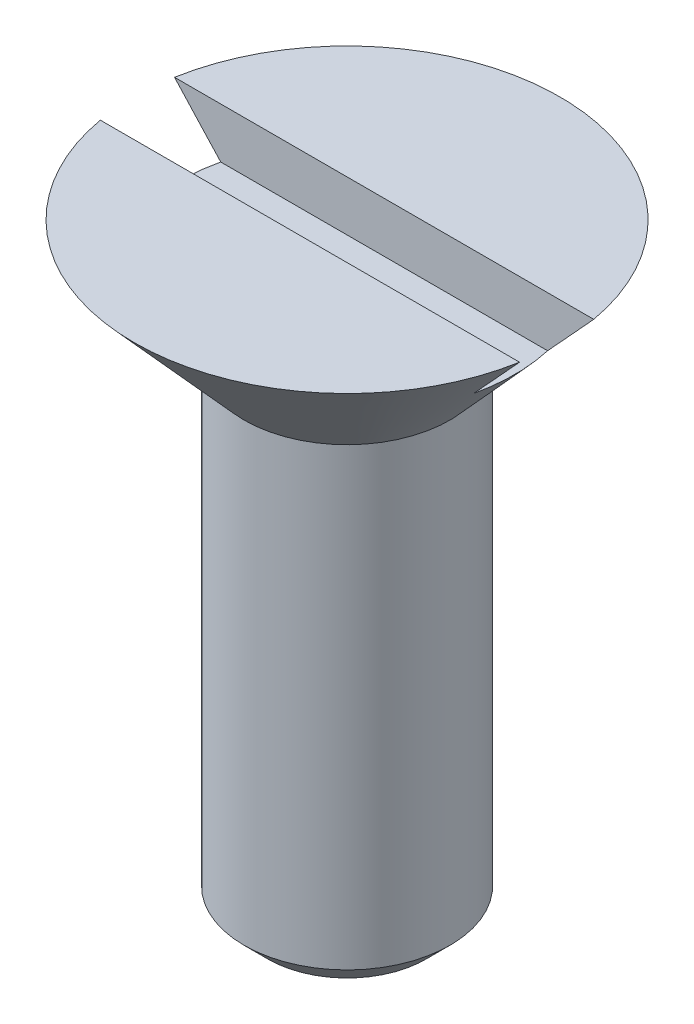
ISO-10303-21;
HEADER;
FILE_DESCRIPTION(('STEP AP214'),'2;1');
FILE_NAME('part.step','',(''),(''),'','','');
FILE_SCHEMA(('AUTOMOTIVE_DESIGN { 1 0 10303 214 1 1 1 1 }'));
ENDSEC;
DATA;
#1=APPLICATION_CONTEXT('core data for automotive mechanical design processes');
#2=APPLICATION_PROTOCOL_DEFINITION('international standard','automotive_design',2000,#1);
#3=PRODUCT_CONTEXT('',#1,'mechanical');
#4=PRODUCT('Part','Part','',(#3));
#5=PRODUCT_RELATED_PRODUCT_CATEGORY('part','',(#4));
#6=PRODUCT_DEFINITION_FORMATION('','',#4);
#7=PRODUCT_DEFINITION_CONTEXT('part definition',#1,'design');
#8=PRODUCT_DEFINITION('design','',#6,#7);
#9=PRODUCT_DEFINITION_SHAPE('','',#8);
#10=(LENGTH_UNIT() NAMED_UNIT(*) SI_UNIT(.MILLI.,.METRE.));
#11=(NAMED_UNIT(*) PLANE_ANGLE_UNIT() SI_UNIT($,.RADIAN.));
#12=(NAMED_UNIT(*) SI_UNIT($,.STERADIAN.) SOLID_ANGLE_UNIT());
#13=UNCERTAINTY_MEASURE_WITH_UNIT(LENGTH_MEASURE(1.E-05),#10,'distance_accuracy_value','');
#14=(GEOMETRIC_REPRESENTATION_CONTEXT(3) GLOBAL_UNCERTAINTY_ASSIGNED_CONTEXT((#13)) GLOBAL_UNIT_ASSIGNED_CONTEXT((#10,
#11,#12)) REPRESENTATION_CONTEXT('',''));
#15=CARTESIAN_POINT('',(0.,0.,0.));
#16=DIRECTION('',(0.,0.,1.));
#17=DIRECTION('',(1.,0.,0.));
#18=AXIS2_PLACEMENT_3D('',#15,#16,#17);
#19=CARTESIAN_POINT('',(0.,1.2954,0.));
#20=DIRECTION('',(0.,1.,0.));
#21=DIRECTION('',(0.,0.,1.));
#22=AXIS2_PLACEMENT_3D('',#19,#20,#21);
#23=PLANE('',#22);
#24=DIRECTION('',(1.,0.,0.));
#25=VECTOR('',#24,1.);
#26=CARTESIAN_POINT('',(0.,1.2954,0.3937));
#27=LINE('',#26,#25);
#28=CARTESIAN_POINT('',(-2.22400523384355,1.2954,0.3937));
#29=VERTEX_POINT('',#28);
#30=CARTESIAN_POINT('',(2.22400523384355,1.2954,0.3937));
#31=VERTEX_POINT('',#30);
#32=EDGE_CURVE('E81',#29,#31,#27,.T.);
#33=ORIENTED_EDGE('',*,*,#32,.F.);
#34=CARTESIAN_POINT('',(0.,1.2954,0.));
#35=DIRECTION('',(0.,-1.,0.));
#36=DIRECTION('',(0.,0.,-1.));
#37=AXIS2_PLACEMENT_3D('',#34,#35,#36);
#38=CIRCLE('',#37,2.25858339898343);
#39=EDGE_CURVE('E94',#31,#29,#38,.T.);
#40=ORIENTED_EDGE('',*,*,#39,.F.);
#41=EDGE_LOOP('',(#33,#40));
#42=FACE_BOUND('',#41,.T.);
#43=ADVANCED_FACE('F33',(#42),#23,.T.);
#44=CARTESIAN_POINT('',(0.,-5.08,0.));
#45=DIRECTION('',(0.,1.,0.));
#46=DIRECTION('',(0.,0.,1.));
#47=AXIS2_PLACEMENT_3D('',#44,#45,#46);
#48=CYLINDRICAL_SURFACE('',#47,1.0922);
#49=CARTESIAN_POINT('',(0.,-4.826,0.));
#50=DIRECTION('',(0.,1.,0.));
#51=DIRECTION('',(0.,0.,1.));
#52=AXIS2_PLACEMENT_3D('',#49,#50,#51);
#53=CIRCLE('',#52,1.0922);
#54=CARTESIAN_POINT('',(0.,-4.826,1.0922));
#55=VERTEX_POINT('',#54);
#56=EDGE_CURVE('E41',#55,#55,#53,.T.);
#57=ORIENTED_EDGE('',*,*,#56,.T.);
#58=EDGE_LOOP('',(#57));
#59=FACE_BOUND('',#58,.T.);
#60=CARTESIAN_POINT('',(0.,0.,0.));
#61=DIRECTION('',(0.,1.,0.));
#62=DIRECTION('',(0.,0.,1.));
#63=AXIS2_PLACEMENT_3D('',#60,#61,#62);
#64=CIRCLE('',#63,1.0922);
#65=CARTESIAN_POINT('',(0.,0.,1.0922));
#66=VERTEX_POINT('',#65);
#67=EDGE_CURVE('E82',#66,#66,#64,.T.);
#68=ORIENTED_EDGE('',*,*,#67,.F.);
#69=EDGE_LOOP('',(#68));
#70=FACE_BOUND('',#69,.T.);
#71=ADVANCED_FACE('F122',(#59,#70),#48,.T.);
#72=CARTESIAN_POINT('',(0.,-5.08,0.));
#73=DIRECTION('',(0.,1.,0.));
#74=DIRECTION('',(0.,0.,1.));
#75=AXIS2_PLACEMENT_3D('',#72,#73,#74);
#76=PLANE('',#75);
#77=CARTESIAN_POINT('',(0.,-5.08,0.));
#78=DIRECTION('',(0.,1.,0.));
#79=DIRECTION('',(0.,0.,1.));
#80=AXIS2_PLACEMENT_3D('',#77,#78,#79);
#81=CIRCLE('',#80,0.838199999999999);
#82=CARTESIAN_POINT('',(0.,-5.08,0.838199999999999));
#83=VERTEX_POINT('',#82);
#84=EDGE_CURVE('E11',#83,#83,#81,.F.);
#85=ORIENTED_EDGE('',*,*,#84,.T.);
#86=EDGE_LOOP('',(#85));
#87=FACE_BOUND('',#86,.T.);
#88=ADVANCED_FACE('F127',(#87),#76,.F.);
#89=CARTESIAN_POINT('',(0.,0.,0.));
#90=DIRECTION('',(0.,1.,0.));
#91=DIRECTION('',(0.,0.,1.));
#92=AXIS2_PLACEMENT_3D('',#89,#90,#91);
#93=CONICAL_SURFACE('',#92,1.0922,0.73303828583762);
#94=CARTESIAN_POINT('',(4.69962160166678,4.02473028612331,0.3937));
#95=CARTESIAN_POINT('',(4.54516580079646,3.85379263610065,0.3937));
#96=CARTESIAN_POINT('',(4.39068462670901,3.68287788348744,0.3937));
#97=CARTESIAN_POINT('',(4.08163754088893,3.3411167283795,0.3937));
#98=CARTESIAN_POINT('',(3.92707162700706,3.17027032782838,0.3937));
#99=CARTESIAN_POINT('',(3.61769489717502,2.82852908338223,0.3937));
#100=CARTESIAN_POINT('',(3.46288398513319,2.65763432647002,0.3937));
#101=CARTESIAN_POINT('',(3.15310272970566,2.31599733513932,0.3937));
#102=CARTESIAN_POINT('',(2.99813239053501,2.14525509690064,0.3937));
#103=CARTESIAN_POINT('',(2.68124717430035,1.796645243119,0.3937));
#104=CARTESIAN_POINT('',(2.51932101807095,1.6187878809242,0.3937));
#105=CARTESIAN_POINT('',(2.19498648742723,1.2634874091984,0.3937));
#106=CARTESIAN_POINT('',(2.03257807694406,1.08604433252099,0.3937));
#107=CARTESIAN_POINT('',(1.7883088418283,0.820585816679217,0.3937));
#108=CARTESIAN_POINT('',(1.70680192296002,0.732244848684066,0.3937));
#109=CARTESIAN_POINT('',(1.54342533943533,0.55589375551013,0.3937));
#110=CARTESIAN_POINT('',(1.46155566496956,0.467883639398417,0.3937));
#111=CARTESIAN_POINT('',(1.29725264856403,0.292414797773865,0.3937));
#112=CARTESIAN_POINT('',(1.21481938825021,0.204955995797093,0.3937));
#113=CARTESIAN_POINT('',(1.04897858612085,0.0309681719889427,0.3937));
#114=CARTESIAN_POINT('',(0.965571103836768,-0.0555609060408232,0.3937));
#115=CARTESIAN_POINT('',(0.860916094308635,-0.161669820289546,0.3937));
#116=CARTESIAN_POINT('',(0.840593996285099,-0.182161045159939,0.3937));
#117=CARTESIAN_POINT('',(0.799806149357845,-0.22300039870542,0.3937));
#118=CARTESIAN_POINT('',(0.779340399238549,-0.243348526166701,0.3937));
#119=CARTESIAN_POINT('',(0.717664701200804,-0.304151542783479,0.3937));
#120=CARTESIAN_POINT('',(0.676196074003011,-0.344344904429168,0.3937));
#121=CARTESIAN_POINT('',(0.592262070964747,-0.423556447536187,0.3937));
#122=CARTESIAN_POINT('',(0.549798394134274,-0.462576404585977,0.3937));
#123=CARTESIAN_POINT('',(0.484782394040786,-0.519575809100989,0.3937));
#124=CARTESIAN_POINT('',(0.462899293166325,-0.53831336215748,0.3937));
#125=CARTESIAN_POINT('',(0.418532525624876,-0.575060084933338,0.3937));
#126=CARTESIAN_POINT('',(0.396048876867211,-0.593069276333466,0.3937));
#127=CARTESIAN_POINT('',(0.342354510627414,-0.634107890703131,0.3937));
#128=CARTESIAN_POINT('',(0.310813267488816,-0.656721172217668,0.3937));
#129=CARTESIAN_POINT('',(0.261875593724924,-0.688071878999099,0.3937));
#130=CARTESIAN_POINT('',(0.245305235470887,-0.698087294541354,0.3937));
#131=CARTESIAN_POINT('',(0.211505986171732,-0.716926320704904,0.3937));
#132=CARTESIAN_POINT('',(0.194277514293318,-0.725750674220633,0.3937));
#133=CARTESIAN_POINT('',(0.155614835188581,-0.743329471985835,0.3937));
#134=CARTESIAN_POINT('',(0.134015844650381,-0.751734427239179,0.3937));
#135=CARTESIAN_POINT('',(0.0898017225338472,-0.765148907949896,0.3937));
#136=CARTESIAN_POINT('',(0.0671895631476502,-0.770167749942222,0.3937));
#137=CARTESIAN_POINT('',(0.0211108323403551,-0.775876362886035,0.3937));
#138=CARTESIAN_POINT('',(-0.00236271722330077,-0.776513727333237,0.3937));
#139=CARTESIAN_POINT('',(-0.0489666130589328,-0.773155833490832,0.3937));
#140=CARTESIAN_POINT('',(-0.0720966634242163,-0.76915679185072,0.3937));
#141=CARTESIAN_POINT('',(-0.1243079358322,-0.755608317058462,0.3937));
#142=CARTESIAN_POINT('',(-0.153028594330211,-0.744728983235246,0.3937));
#143=CARTESIAN_POINT('',(-0.194697252348328,-0.725420468284154,0.3937));
#144=CARTESIAN_POINT('',(-0.208390519850292,-0.718460515759535,0.3937));
#145=CARTESIAN_POINT('',(-0.235350790600315,-0.703758739224833,0.3937));
#146=CARTESIAN_POINT('',(-0.248617917724216,-0.696017145193697,0.3937));
#147=CARTESIAN_POINT('',(-0.287001996163141,-0.672423509773338,0.3937));
#148=CARTESIAN_POINT('',(-0.311609914810393,-0.655751264046823,0.3937));
#149=CARTESIAN_POINT('',(-0.359822652677773,-0.621003831788795,0.3937));
#150=CARTESIAN_POINT('',(-0.38342658801077,-0.602927447087337,0.3937));
#151=CARTESIAN_POINT('',(-0.429949987536502,-0.565804535091045,0.3937));
#152=CARTESIAN_POINT('',(-0.452867603039957,-0.54675570640129,0.3937));
#153=CARTESIAN_POINT('',(-0.498153153717638,-0.508013170430537,0.3937));
#154=CARTESIAN_POINT('',(-0.520521002370722,-0.488319362767322,0.3937));
#155=CARTESIAN_POINT('',(-0.587219751109155,-0.42836923446286,0.3937));
#156=CARTESIAN_POINT('',(-0.630929014876939,-0.387423566555253,0.3937));
#157=CARTESIAN_POINT('',(-0.717287134365628,-0.304589195937906,0.3937));
#158=CARTESIAN_POINT('',(-0.759937683849047,-0.262702235393409,0.3937));
#159=CARTESIAN_POINT('',(-0.844011063659557,-0.178878532054478,0.3937));
#160=CARTESIAN_POINT('',(-0.885442720568758,-0.13695062872644,0.3937));
#161=CARTESIAN_POINT('',(-0.96788163893008,-0.0526799447740879,0.3937));
#162=CARTESIAN_POINT('',(-1.00888889448907,-0.0103371584046668,0.3937));
#163=CARTESIAN_POINT('',(-1.13147167360593,0.117126635645581,0.3937));
#164=CARTESIAN_POINT('',(-1.2126012309821,0.202676021981576,0.3937));
#165=CARTESIAN_POINT('',(-1.37427338727631,0.374460480455851,0.3937));
#166=CARTESIAN_POINT('',(-1.45481543456548,0.460696069209217,0.3937));
#167=CARTESIAN_POINT('',(-1.61548459398903,0.63354540559477,0.3937));
#168=CARTESIAN_POINT('',(-1.69561172499114,0.720159135695455,0.3937));
#169=CARTESIAN_POINT('',(-1.93474797786911,0.979441518643729,0.3937));
#170=CARTESIAN_POINT('',(-2.09336814785037,1.15246849436829,0.3937));
#171=CARTESIAN_POINT('',(-2.41005079931334,1.49893806650191,0.3937));
#172=CARTESIAN_POINT('',(-2.56811343050504,1.67238052636375,0.3937));
#173=CARTESIAN_POINT('',(-2.89046175745503,2.0267076602209,0.3937));
#174=CARTESIAN_POINT('',(-3.05473482414477,2.20760382253615,0.3937));
#175=CARTESIAN_POINT('',(-3.38309935805641,2.56959393094098,0.3937));
#176=CARTESIAN_POINT('',(-3.54719080537028,2.75068789507932,0.3937));
#177=CARTESIAN_POINT('',(-3.87606601447037,3.11390212432364,0.3937));
#178=CARTESIAN_POINT('',(-4.04084912164535,3.29602298208035,0.3937));
#179=CARTESIAN_POINT('',(-4.37030469074301,3.66033089787537,0.3937));
#180=CARTESIAN_POINT('',(-4.53497716225792,3.84251794723851,0.3937));
#181=CARTESIAN_POINT('',(-4.69962160166678,4.02473028612331,0.3937));
#182=B_SPLINE_CURVE_WITH_KNOTS('',3,(#94,#95,#96,#97,#98,#99,#100,#101,#102,#103,#104,#105,#106,
#107,#108,#109,#110,#111,#112,#113,#114,#115,#116,#117,#118,#119,#120,#121,#122,#123,#124,#125,
#126,#127,#128,#129,#130,#131,#132,#133,#134,#135,#136,#137,#138,#139,#140,#141,#142,#143,#144,
#145,#146,#147,#148,#149,#150,#151,#152,#153,#154,#155,#156,#157,#158,#159,#160,#161,#162,#163,
#164,#165,#166,#167,#168,#169,#170,#171,#172,#173,#174,#175,#176,#177,#178,#179,#180,#181),
.UNSPECIFIED.,.F.,.F.,(4,2,2,2,2,2,2,2,2,2,2,2,2,2,2,2,2,2,2,2,2,2,2,2,2,2,2,2,2,2,2,2,2,2,2,2,
2,2,2,2,2,2,2,4),(0.,0.691148692895704,1.38231581118585,2.07408373044153,2.76583380755793,
3.48741512431974,4.20905184207579,4.56964470091731,4.93024737088319,5.29079887561608,
5.65132846232506,5.73790671614629,5.82448570347462,5.99772837653701,6.17069416006522,
6.25710823125436,6.34351972830504,6.45979651836381,6.51784702070637,6.5758611465466,
6.6451931581723,6.71433362351736,6.78429965542016,6.85432282046363,6.94590734058854,
6.99197806508387,7.03803527367616,7.12712098942621,7.21628357635996,7.30566795681648,
7.39506631547347,7.57470646010571,7.75403778748934,7.93086837074606,8.10770140614106,
8.46139724670566,8.81539084632289,9.16936820466898,9.87355900855986,10.5775435987321,
11.3106064389874,12.0437429455626,12.7805558483749,13.5172933971431),.UNSPECIFIED.);
#183=CARTESIAN_POINT('',(-1.73417970012101,0.762,0.3937));
#184=VERTEX_POINT('',#183);
#185=EDGE_CURVE('E91',#184,#29,#182,.T.);
#186=ORIENTED_EDGE('',*,*,#185,.F.);
#187=CARTESIAN_POINT('',(0.,0.762,0.));
#188=DIRECTION('',(0.,-1.,0.));
#189=DIRECTION('',(0.,0.,-1.));
#190=AXIS2_PLACEMENT_3D('',#187,#188,#189);
#191=CIRCLE('',#190,1.77830788175496);
#192=CARTESIAN_POINT('',(-1.73417970012101,0.762,-0.3937));
#193=VERTEX_POINT('',#192);
#194=EDGE_CURVE('E90',#193,#184,#191,.F.);
#195=ORIENTED_EDGE('',*,*,#194,.F.);
#196=CARTESIAN_POINT('',(-4.69962160166678,4.02473028612331,-0.3937));
#197=CARTESIAN_POINT('',(-4.54516580079646,3.85379263610065,-0.3937));
#198=CARTESIAN_POINT('',(-4.39068462670901,3.68287788348745,-0.3937));
#199=CARTESIAN_POINT('',(-4.08163754088893,3.3411167283795,-0.3937));
#200=CARTESIAN_POINT('',(-3.92707162700706,3.17027032782838,-0.3937));
#201=CARTESIAN_POINT('',(-3.61769489717502,2.82852908338223,-0.3937));
#202=CARTESIAN_POINT('',(-3.46288398513319,2.65763432647002,-0.3937));
#203=CARTESIAN_POINT('',(-3.15310272970566,2.31599733513932,-0.3937));
#204=CARTESIAN_POINT('',(-2.99813239053501,2.14525509690064,-0.3937));
#205=CARTESIAN_POINT('',(-2.68124717430035,1.796645243119,-0.3937));
#206=CARTESIAN_POINT('',(-2.51932101807095,1.6187878809242,-0.3937));
#207=CARTESIAN_POINT('',(-2.19498648742723,1.2634874091984,-0.3937));
#208=CARTESIAN_POINT('',(-2.03257807694406,1.08604433252099,-0.3937));
#209=CARTESIAN_POINT('',(-1.7883088418283,0.820585816679218,-0.3937));
#210=CARTESIAN_POINT('',(-1.70680192296002,0.732244848684067,-0.3937));
#211=CARTESIAN_POINT('',(-1.54342533943534,0.55589375551013,-0.3937));
#212=CARTESIAN_POINT('',(-1.46155566496956,0.467883639398418,-0.3937));
#213=CARTESIAN_POINT('',(-1.29725264856403,0.292414797773866,-0.3937));
#214=CARTESIAN_POINT('',(-1.21481938825021,0.204955995797094,-0.3937));
#215=CARTESIAN_POINT('',(-1.04897858612085,0.0309681719889435,-0.3937));
#216=CARTESIAN_POINT('',(-0.965571103836769,-0.0555609060408226,-0.3937));
#217=CARTESIAN_POINT('',(-0.860916094308636,-0.161669820289545,-0.3937));
#218=CARTESIAN_POINT('',(-0.8405939962851,-0.182161045159938,-0.3937));
#219=CARTESIAN_POINT('',(-0.799806149357846,-0.22300039870542,-0.3937));
#220=CARTESIAN_POINT('',(-0.779340399238549,-0.2433485261667,-0.3937));
#221=CARTESIAN_POINT('',(-0.717664701200805,-0.304151542783479,-0.3937));
#222=CARTESIAN_POINT('',(-0.676196074003011,-0.344344904429168,-0.3937));
#223=CARTESIAN_POINT('',(-0.592262070964747,-0.423556447536187,-0.3937));
#224=CARTESIAN_POINT('',(-0.549798394134274,-0.462576404585977,-0.3937));
#225=CARTESIAN_POINT('',(-0.484782394040787,-0.519575809100988,-0.3937));
#226=CARTESIAN_POINT('',(-0.462899293166325,-0.53831336215748,-0.3937));
#227=CARTESIAN_POINT('',(-0.418532525624876,-0.575060084933338,-0.3937));
#228=CARTESIAN_POINT('',(-0.396048876867211,-0.593069276333465,-0.3937));
#229=CARTESIAN_POINT('',(-0.342354510627415,-0.634107890703131,-0.3937));
#230=CARTESIAN_POINT('',(-0.310813267488816,-0.656721172217668,-0.3937));
#231=CARTESIAN_POINT('',(-0.261875593724924,-0.688071878999099,-0.3937));
#232=CARTESIAN_POINT('',(-0.245305235470888,-0.698087294541354,-0.3937));
#233=CARTESIAN_POINT('',(-0.211505986171733,-0.716926320704904,-0.3937));
#234=CARTESIAN_POINT('',(-0.194277514293318,-0.725750674220633,-0.3937));
#235=CARTESIAN_POINT('',(-0.155614835188582,-0.743329471985835,-0.3937));
#236=CARTESIAN_POINT('',(-0.134015844650382,-0.751734427239179,-0.3937));
#237=CARTESIAN_POINT('',(-0.0898017225338483,-0.765148907949896,-0.3937));
#238=CARTESIAN_POINT('',(-0.067189563147651,-0.770167749942222,-0.3937));
#239=CARTESIAN_POINT('',(-0.0211108323403558,-0.775876362886035,-0.3937));
#240=CARTESIAN_POINT('',(0.0023627172232998,-0.776513727333237,-0.3937));
#241=CARTESIAN_POINT('',(0.0489666130589318,-0.773155833490832,-0.3937));
#242=CARTESIAN_POINT('',(0.0720966634242157,-0.76915679185072,-0.3937));
#243=CARTESIAN_POINT('',(0.124307935832199,-0.755608317058462,-0.3937));
#244=CARTESIAN_POINT('',(0.15302859433021,-0.744728983235246,-0.3937));
#245=CARTESIAN_POINT('',(0.194697252348328,-0.725420468284154,-0.3937));
#246=CARTESIAN_POINT('',(0.208390519850291,-0.718460515759536,-0.3937));
#247=CARTESIAN_POINT('',(0.235350790600314,-0.703758739224833,-0.3937));
#248=CARTESIAN_POINT('',(0.248617917724216,-0.696017145193698,-0.3937));
#249=CARTESIAN_POINT('',(0.287001996163141,-0.672423509773339,-0.3937));
#250=CARTESIAN_POINT('',(0.311609914810393,-0.655751264046823,-0.3937));
#251=CARTESIAN_POINT('',(0.359822652677772,-0.621003831788796,-0.3937));
#252=CARTESIAN_POINT('',(0.383426588010769,-0.602927447087338,-0.3937));
#253=CARTESIAN_POINT('',(0.429949987536501,-0.565804535091046,-0.3937));
#254=CARTESIAN_POINT('',(0.452867603039956,-0.546755706401291,-0.3937));
#255=CARTESIAN_POINT('',(0.498153153717637,-0.508013170430539,-0.3937));
#256=CARTESIAN_POINT('',(0.52052100237072,-0.488319362767323,-0.3937));
#257=CARTESIAN_POINT('',(0.587219751109153,-0.428369234462862,-0.3937));
#258=CARTESIAN_POINT('',(0.630929014876937,-0.387423566555255,-0.3937));
#259=CARTESIAN_POINT('',(0.717287134365626,-0.304589195937908,-0.3937));
#260=CARTESIAN_POINT('',(0.759937683849046,-0.262702235393412,-0.3937));
#261=CARTESIAN_POINT('',(0.844011063659555,-0.17887853205448,-0.3937));
#262=CARTESIAN_POINT('',(0.885442720568756,-0.136950628726442,-0.3937));
#263=CARTESIAN_POINT('',(0.967881638930077,-0.05267994477409,-0.3937));
#264=CARTESIAN_POINT('',(1.00888889448907,-0.0103371584046693,-0.3937));
#265=CARTESIAN_POINT('',(1.13147167360592,0.117126635645578,-0.3937));
#266=CARTESIAN_POINT('',(1.2126012309821,0.202676021981572,-0.3937));
#267=CARTESIAN_POINT('',(1.3742733872763,0.374460480455846,-0.3937));
#268=CARTESIAN_POINT('',(1.45481543456548,0.460696069209212,-0.3937));
#269=CARTESIAN_POINT('',(1.61548459398903,0.633545405594764,-0.3937));
#270=CARTESIAN_POINT('',(1.69561172499114,0.720159135695449,-0.3937));
#271=CARTESIAN_POINT('',(1.93474797786911,0.979441518643723,-0.3937));
#272=CARTESIAN_POINT('',(2.09336814785037,1.15246849436829,-0.3937));
#273=CARTESIAN_POINT('',(2.41005079931334,1.4989380665019,-0.3937));
#274=CARTESIAN_POINT('',(2.56811343050503,1.67238052636374,-0.3937));
#275=CARTESIAN_POINT('',(2.89046175745502,2.0267076602209,-0.3937));
#276=CARTESIAN_POINT('',(3.05473482414476,2.20760382253614,-0.3937));
#277=CARTESIAN_POINT('',(3.38309935805641,2.56959393094098,-0.3937));
#278=CARTESIAN_POINT('',(3.54719080537027,2.75068789507931,-0.3937));
#279=CARTESIAN_POINT('',(3.87606601447036,3.11390212432363,-0.3937));
#280=CARTESIAN_POINT('',(4.04084912164534,3.29602298208035,-0.3937));
#281=CARTESIAN_POINT('',(4.37030469074301,3.66033089787536,-0.3937));
#282=CARTESIAN_POINT('',(4.53497716225791,3.84251794723851,-0.3937));
#283=CARTESIAN_POINT('',(4.69962160166678,4.02473028612331,-0.3937));
#284=B_SPLINE_CURVE_WITH_KNOTS('',3,(#196,#197,#198,#199,#200,#201,#202,#203,#204,#205,#206,
#207,#208,#209,#210,#211,#212,#213,#214,#215,#216,#217,#218,#219,#220,#221,#222,#223,#224,#225,
#226,#227,#228,#229,#230,#231,#232,#233,#234,#235,#236,#237,#238,#239,#240,#241,#242,#243,#244,
#245,#246,#247,#248,#249,#250,#251,#252,#253,#254,#255,#256,#257,#258,#259,#260,#261,#262,#263,
#264,#265,#266,#267,#268,#269,#270,#271,#272,#273,#274,#275,#276,#277,#278,#279,#280,#281,#282,
#283),.UNSPECIFIED.,.F.,.F.,(4,2,2,2,2,2,2,2,2,2,2,2,2,2,2,2,2,2,2,2,2,2,2,2,2,2,2,2,2,2,2,2,2,
2,2,2,2,2,2,2,2,2,2,4),(0.,0.691148692895704,1.38231581118585,2.07408373044153,2.76583380755793,
3.48741512431974,4.20905184207579,4.56964470091731,4.93024737088319,5.29079887561608,
5.65132846232506,5.73790671614629,5.82448570347463,5.99772837653701,6.17069416006522,
6.25710823125436,6.34351972830504,6.45979651836382,6.51784702070637,6.5758611465466,
6.64519315817231,6.71433362351737,6.78429965542016,6.85432282046363,6.94590734058854,
6.99197806508387,7.03803527367616,7.12712098942621,7.21628357635996,7.30566795681648,
7.39506631547347,7.57470646010571,7.75403778748934,7.93086837074606,8.10770140614106,
8.46139724670565,8.81539084632289,9.16936820466897,9.87355900855986,10.5775435987321,
11.3106064389874,12.0437429455626,12.7805558483749,13.5172933971431),.UNSPECIFIED.);
#285=CARTESIAN_POINT('',(-2.22400523384355,1.2954,-0.3937));
#286=VERTEX_POINT('',#285);
#287=EDGE_CURVE('E76',#286,#193,#284,.T.);
#288=ORIENTED_EDGE('',*,*,#287,.F.);
#289=CARTESIAN_POINT('',(2.22400523384355,1.2954,-0.3937));
#290=VERTEX_POINT('',#289);
#291=EDGE_CURVE('E89',#286,#290,#38,.T.);
#292=ORIENTED_EDGE('',*,*,#291,.T.);
#293=CARTESIAN_POINT('',(1.73417970012101,0.762,-0.3937));
#294=VERTEX_POINT('',#293);
#295=EDGE_CURVE('E48',#294,#290,#284,.T.);
#296=ORIENTED_EDGE('',*,*,#295,.F.);
#297=CARTESIAN_POINT('',(1.73417970012101,0.762,0.3937));
#298=VERTEX_POINT('',#297);
#299=EDGE_CURVE('E107',#298,#294,#191,.F.);
#300=ORIENTED_EDGE('',*,*,#299,.F.);
#301=EDGE_CURVE('E56',#31,#298,#182,.T.);
#302=ORIENTED_EDGE('',*,*,#301,.F.);
#303=ORIENTED_EDGE('',*,*,#39,.T.);
#304=EDGE_LOOP('',(#186,#195,#288,#292,#296,#300,#302,#303));
#305=FACE_BOUND('',#304,.T.);
#306=ORIENTED_EDGE('',*,*,#67,.T.);
#307=EDGE_LOOP('',(#306));
#308=FACE_BOUND('',#307,.T.);
#309=ADVANCED_FACE('F87',(#305,#308),#93,.T.);
#310=DIRECTION('',(-1.,0.,0.));
#311=VECTOR('',#310,1.);
#312=CARTESIAN_POINT('',(0.,1.2954,-0.3937));
#313=LINE('',#312,#311);
#314=EDGE_CURVE('E73',#290,#286,#313,.T.);
#315=ORIENTED_EDGE('',*,*,#314,.F.);
#316=ORIENTED_EDGE('',*,*,#291,.F.);
#317=EDGE_LOOP('',(#315,#316));
#318=FACE_BOUND('',#317,.T.);
#319=ADVANCED_FACE('F93',(#318),#23,.T.);
#320=CARTESIAN_POINT('',(-2.25858339898343,0.762,0.3937));
#321=DIRECTION('',(0.,0.,1.));
#322=DIRECTION('',(1.,0.,0.));
#323=AXIS2_PLACEMENT_3D('',#320,#321,#322);
#324=PLANE('',#323);
#325=ORIENTED_EDGE('',*,*,#301,.T.);
#326=DIRECTION('',(1.,0.,0.));
#327=VECTOR('',#326,1.);
#328=CARTESIAN_POINT('',(-2.25858339898343,0.762,0.3937));
#329=LINE('',#328,#327);
#330=EDGE_CURVE('E113',#184,#298,#329,.T.);
#331=ORIENTED_EDGE('',*,*,#330,.F.);
#332=ORIENTED_EDGE('',*,*,#185,.T.);
#333=ORIENTED_EDGE('',*,*,#32,.T.);
#334=EDGE_LOOP('',(#325,#331,#332,#333));
#335=FACE_BOUND('',#334,.T.);
#336=ADVANCED_FACE('F116',(#335),#324,.F.);
#337=CARTESIAN_POINT('',(-2.25858339898343,0.762,-0.3937));
#338=DIRECTION('',(0.,0.,-1.));
#339=DIRECTION('',(-1.,0.,0.));
#340=AXIS2_PLACEMENT_3D('',#337,#338,#339);
#341=PLANE('',#340);
#342=ORIENTED_EDGE('',*,*,#287,.T.);
#343=DIRECTION('',(-1.,0.,0.));
#344=VECTOR('',#343,1.);
#345=CARTESIAN_POINT('',(-2.25858339898343,0.762,-0.3937));
#346=LINE('',#345,#344);
#347=EDGE_CURVE('E115',#294,#193,#346,.T.);
#348=ORIENTED_EDGE('',*,*,#347,.F.);
#349=ORIENTED_EDGE('',*,*,#295,.T.);
#350=ORIENTED_EDGE('',*,*,#314,.T.);
#351=EDGE_LOOP('',(#342,#348,#349,#350));
#352=FACE_BOUND('',#351,.T.);
#353=ADVANCED_FACE('F75',(#352),#341,.F.);
#354=CARTESIAN_POINT('',(0.,0.762,0.));
#355=DIRECTION('',(0.,-1.,0.));
#356=DIRECTION('',(0.,0.,-1.));
#357=AXIS2_PLACEMENT_3D('',#354,#355,#356);
#358=PLANE('',#357);
#359=ORIENTED_EDGE('',*,*,#194,.T.);
#360=ORIENTED_EDGE('',*,*,#330,.T.);
#361=ORIENTED_EDGE('',*,*,#299,.T.);
#362=ORIENTED_EDGE('',*,*,#347,.T.);
#363=EDGE_LOOP('',(#359,#360,#361,#362));
#364=FACE_BOUND('',#363,.T.);
#365=ADVANCED_FACE('F112',(#364),#358,.F.);
#366=CARTESIAN_POINT('',(0.,-4.826,0.));
#367=DIRECTION('',(0.,1.,0.));
#368=DIRECTION('',(0.,0.,1.));
#369=AXIS2_PLACEMENT_3D('',#366,#367,#368);
#370=CONICAL_SURFACE('',#369,1.0922,0.78539816339745);
#371=ORIENTED_EDGE('',*,*,#84,.F.);
#372=EDGE_LOOP('',(#371));
#373=FACE_BOUND('',#372,.T.);
#374=ORIENTED_EDGE('',*,*,#56,.F.);
#375=EDGE_LOOP('',(#374));
#376=FACE_BOUND('',#375,.T.);
#377=ADVANCED_FACE('F35',(#373,#376),#370,.T.);
#378=CLOSED_SHELL('',(#43,#71,#88,#309,#319,#336,#353,#365,#377));
#379=MANIFOLD_SOLID_BREP('B2',#378);
#380=ADVANCED_BREP_SHAPE_REPRESENTATION('',(#18,#379),#14);
#381=SHAPE_DEFINITION_REPRESENTATION(#9,#380);
ENDSEC;
END-ISO-10303-21;
